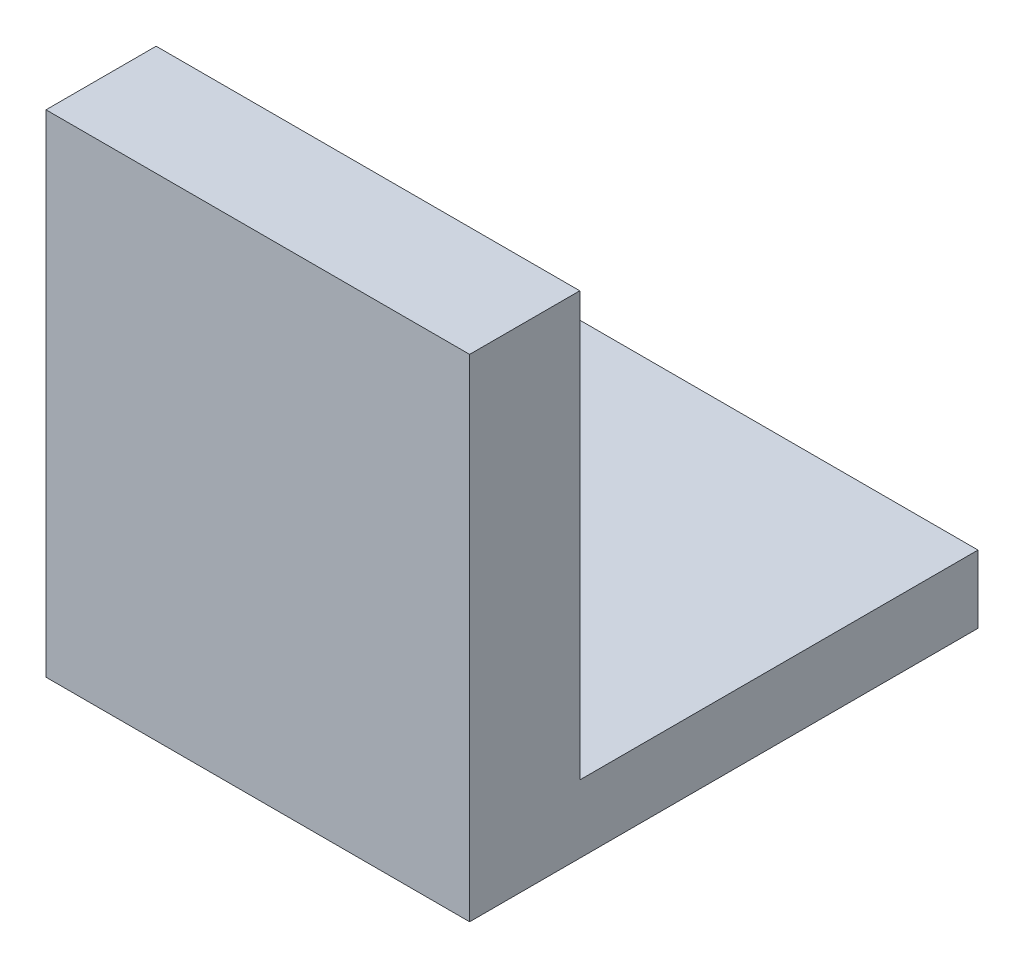
ISO-10303-21;
HEADER;
FILE_DESCRIPTION(('STEP AP214'),'2;1');
FILE_NAME('part.step','',(''),(''),'','','');
FILE_SCHEMA(('AUTOMOTIVE_DESIGN { 1 0 10303 214 1 1 1 1 }'));
ENDSEC;
DATA;
#1=APPLICATION_CONTEXT('core data for automotive mechanical design processes');
#2=APPLICATION_PROTOCOL_DEFINITION('international standard','automotive_design',2000,#1);
#3=PRODUCT_CONTEXT('',#1,'mechanical');
#4=PRODUCT('Part','Part','',(#3));
#5=PRODUCT_RELATED_PRODUCT_CATEGORY('part','',(#4));
#6=PRODUCT_DEFINITION_FORMATION('','',#4);
#7=PRODUCT_DEFINITION_CONTEXT('part definition',#1,'design');
#8=PRODUCT_DEFINITION('design','',#6,#7);
#9=PRODUCT_DEFINITION_SHAPE('','',#8);
#10=(LENGTH_UNIT() NAMED_UNIT(*) SI_UNIT(.MILLI.,.METRE.));
#11=(NAMED_UNIT(*) PLANE_ANGLE_UNIT() SI_UNIT($,.RADIAN.));
#12=(NAMED_UNIT(*) SI_UNIT($,.STERADIAN.) SOLID_ANGLE_UNIT());
#13=UNCERTAINTY_MEASURE_WITH_UNIT(LENGTH_MEASURE(1.E-05),#10,'distance_accuracy_value','');
#14=(GEOMETRIC_REPRESENTATION_CONTEXT(3) GLOBAL_UNCERTAINTY_ASSIGNED_CONTEXT((#13)) GLOBAL_UNIT_ASSIGNED_CONTEXT((#10,
#11,#12)) REPRESENTATION_CONTEXT('',''));
#15=CARTESIAN_POINT('',(0.,0.,0.));
#16=DIRECTION('',(0.,0.,1.));
#17=DIRECTION('',(1.,0.,0.));
#18=AXIS2_PLACEMENT_3D('',#15,#16,#17);
#19=CARTESIAN_POINT('',(0.,8.,0.));
#20=DIRECTION('',(0.,-1.,0.));
#21=DIRECTION('',(0.,0.,-1.));
#22=AXIS2_PLACEMENT_3D('',#19,#20,#21);
#23=PLANE('',#22);
#24=DIRECTION('',(-1.,0.,0.));
#25=VECTOR('',#24,1.);
#26=CARTESIAN_POINT('',(-25.,8.,17.));
#27=LINE('',#26,#25);
#28=CARTESIAN_POINT('',(25.,8.,17.));
#29=VERTEX_POINT('',#28);
#30=CARTESIAN_POINT('',(-25.,8.,17.));
#31=VERTEX_POINT('',#30);
#32=EDGE_CURVE('E56',#29,#31,#27,.T.);
#33=ORIENTED_EDGE('',*,*,#32,.F.);
#34=DIRECTION('',(0.,0.,-1.));
#35=VECTOR('',#34,1.);
#36=CARTESIAN_POINT('',(25.,8.,30.));
#37=LINE('',#36,#35);
#38=CARTESIAN_POINT('',(25.,8.,-30.));
#39=VERTEX_POINT('',#38);
#40=EDGE_CURVE('E94',#29,#39,#37,.T.);
#41=ORIENTED_EDGE('',*,*,#40,.T.);
#42=DIRECTION('',(-1.,0.,0.));
#43=VECTOR('',#42,1.);
#44=CARTESIAN_POINT('',(-25.,8.,-30.));
#45=LINE('',#44,#43);
#46=CARTESIAN_POINT('',(-25.,8.,-30.));
#47=VERTEX_POINT('',#46);
#48=EDGE_CURVE('E62',#39,#47,#45,.T.);
#49=ORIENTED_EDGE('',*,*,#48,.T.);
#50=DIRECTION('',(0.,0.,1.));
#51=VECTOR('',#50,1.);
#52=CARTESIAN_POINT('',(-25.,8.,30.));
#53=LINE('',#52,#51);
#54=EDGE_CURVE('E105',#47,#31,#53,.T.);
#55=ORIENTED_EDGE('',*,*,#54,.T.);
#56=EDGE_LOOP('',(#33,#41,#49,#55));
#57=FACE_BOUND('',#56,.T.);
#58=ADVANCED_FACE('F41',(#57),#23,.F.);
#59=CARTESIAN_POINT('',(25.,8.,30.));
#60=DIRECTION('',(-1.,0.,0.));
#61=DIRECTION('',(0.,0.,1.));
#62=AXIS2_PLACEMENT_3D('',#59,#60,#61);
#63=PLANE('',#62);
#64=DIRECTION('',(0.,0.,-1.));
#65=VECTOR('',#64,1.);
#66=CARTESIAN_POINT('',(25.,0.,30.));
#67=LINE('',#66,#65);
#68=CARTESIAN_POINT('',(25.,0.,30.));
#69=VERTEX_POINT('',#68);
#70=CARTESIAN_POINT('',(25.,0.,-30.));
#71=VERTEX_POINT('',#70);
#72=EDGE_CURVE('E101',#69,#71,#67,.T.);
#73=ORIENTED_EDGE('',*,*,#72,.T.);
#74=DIRECTION('',(0.,-1.,0.));
#75=VECTOR('',#74,1.);
#76=CARTESIAN_POINT('',(25.,8.,-30.));
#77=LINE('',#76,#75);
#78=EDGE_CURVE('E11',#39,#71,#77,.T.);
#79=ORIENTED_EDGE('',*,*,#78,.F.);
#80=ORIENTED_EDGE('',*,*,#40,.F.);
#81=DIRECTION('',(0.,-1.,0.));
#82=VECTOR('',#81,1.);
#83=CARTESIAN_POINT('',(25.,58.,17.));
#84=LINE('',#83,#82);
#85=CARTESIAN_POINT('',(25.,58.,17.));
#86=VERTEX_POINT('',#85);
#87=EDGE_CURVE('E109',#86,#29,#84,.T.);
#88=ORIENTED_EDGE('',*,*,#87,.F.);
#89=DIRECTION('',(0.,0.,-1.));
#90=VECTOR('',#89,1.);
#91=CARTESIAN_POINT('',(25.,58.,30.));
#92=LINE('',#91,#90);
#93=CARTESIAN_POINT('',(25.,58.,30.));
#94=VERTEX_POINT('',#93);
#95=EDGE_CURVE('E104',#94,#86,#92,.T.);
#96=ORIENTED_EDGE('',*,*,#95,.F.);
#97=DIRECTION('',(0.,-1.,0.));
#98=VECTOR('',#97,1.);
#99=CARTESIAN_POINT('',(25.,8.,30.));
#100=LINE('',#99,#98);
#101=EDGE_CURVE('E87',#94,#69,#100,.T.);
#102=ORIENTED_EDGE('',*,*,#101,.T.);
#103=EDGE_LOOP('',(#73,#79,#80,#88,#96,#102));
#104=FACE_BOUND('',#103,.T.);
#105=ADVANCED_FACE('F43',(#104),#63,.F.);
#106=CARTESIAN_POINT('',(-25.,8.,-30.));
#107=DIRECTION('',(0.,0.,1.));
#108=DIRECTION('',(1.,0.,0.));
#109=AXIS2_PLACEMENT_3D('',#106,#107,#108);
#110=PLANE('',#109);
#111=DIRECTION('',(-1.,0.,0.));
#112=VECTOR('',#111,1.);
#113=CARTESIAN_POINT('',(-25.,0.,-30.));
#114=LINE('',#113,#112);
#115=CARTESIAN_POINT('',(-25.,0.,-30.));
#116=VERTEX_POINT('',#115);
#117=EDGE_CURVE('E108',#71,#116,#114,.T.);
#118=ORIENTED_EDGE('',*,*,#117,.T.);
#119=DIRECTION('',(0.,-1.,0.));
#120=VECTOR('',#119,1.);
#121=CARTESIAN_POINT('',(-25.,8.,-30.));
#122=LINE('',#121,#120);
#123=EDGE_CURVE('E49',#47,#116,#122,.T.);
#124=ORIENTED_EDGE('',*,*,#123,.F.);
#125=ORIENTED_EDGE('',*,*,#48,.F.);
#126=ORIENTED_EDGE('',*,*,#78,.T.);
#127=EDGE_LOOP('',(#118,#124,#125,#126));
#128=FACE_BOUND('',#127,.T.);
#129=ADVANCED_FACE('F125',(#128),#110,.F.);
#130=CARTESIAN_POINT('',(-25.,8.,30.));
#131=DIRECTION('',(1.,0.,0.));
#132=DIRECTION('',(0.,0.,-1.));
#133=AXIS2_PLACEMENT_3D('',#130,#131,#132);
#134=PLANE('',#133);
#135=DIRECTION('',(0.,0.,1.));
#136=VECTOR('',#135,1.);
#137=CARTESIAN_POINT('',(-25.,0.,30.));
#138=LINE('',#137,#136);
#139=CARTESIAN_POINT('',(-25.,0.,30.));
#140=VERTEX_POINT('',#139);
#141=EDGE_CURVE('E95',#116,#140,#138,.T.);
#142=ORIENTED_EDGE('',*,*,#141,.T.);
#143=DIRECTION('',(0.,-1.,0.));
#144=VECTOR('',#143,1.);
#145=CARTESIAN_POINT('',(-25.,8.,30.));
#146=LINE('',#145,#144);
#147=CARTESIAN_POINT('',(-25.,58.,30.));
#148=VERTEX_POINT('',#147);
#149=EDGE_CURVE('E90',#148,#140,#146,.T.);
#150=ORIENTED_EDGE('',*,*,#149,.F.);
#151=DIRECTION('',(0.,0.,1.));
#152=VECTOR('',#151,1.);
#153=CARTESIAN_POINT('',(-25.,58.,30.));
#154=LINE('',#153,#152);
#155=CARTESIAN_POINT('',(-25.,58.,17.));
#156=VERTEX_POINT('',#155);
#157=EDGE_CURVE('E145',#156,#148,#154,.T.);
#158=ORIENTED_EDGE('',*,*,#157,.F.);
#159=DIRECTION('',(0.,-1.,0.));
#160=VECTOR('',#159,1.);
#161=CARTESIAN_POINT('',(-25.,58.,17.));
#162=LINE('',#161,#160);
#163=EDGE_CURVE('E113',#156,#31,#162,.T.);
#164=ORIENTED_EDGE('',*,*,#163,.T.);
#165=ORIENTED_EDGE('',*,*,#54,.F.);
#166=ORIENTED_EDGE('',*,*,#123,.T.);
#167=EDGE_LOOP('',(#142,#150,#158,#164,#165,#166));
#168=FACE_BOUND('',#167,.T.);
#169=ADVANCED_FACE('F122',(#168),#134,.F.);
#170=CARTESIAN_POINT('',(-25.,8.,30.));
#171=DIRECTION('',(0.,0.,-1.));
#172=DIRECTION('',(-1.,0.,0.));
#173=AXIS2_PLACEMENT_3D('',#170,#171,#172);
#174=PLANE('',#173);
#175=DIRECTION('',(1.,0.,0.));
#176=VECTOR('',#175,1.);
#177=CARTESIAN_POINT('',(-25.,0.,30.));
#178=LINE('',#177,#176);
#179=EDGE_CURVE('E82',#140,#69,#178,.T.);
#180=ORIENTED_EDGE('',*,*,#179,.T.);
#181=ORIENTED_EDGE('',*,*,#101,.F.);
#182=DIRECTION('',(1.,0.,0.));
#183=VECTOR('',#182,1.);
#184=CARTESIAN_POINT('',(-25.,58.,30.));
#185=LINE('',#184,#183);
#186=EDGE_CURVE('E141',#148,#94,#185,.T.);
#187=ORIENTED_EDGE('',*,*,#186,.F.);
#188=ORIENTED_EDGE('',*,*,#149,.T.);
#189=EDGE_LOOP('',(#180,#181,#187,#188));
#190=FACE_BOUND('',#189,.T.);
#191=ADVANCED_FACE('F84',(#190),#174,.F.);
#192=CARTESIAN_POINT('',(0.,0.,0.));
#193=DIRECTION('',(0.,-1.,0.));
#194=DIRECTION('',(0.,0.,-1.));
#195=AXIS2_PLACEMENT_3D('',#192,#193,#194);
#196=PLANE('',#195);
#197=ORIENTED_EDGE('',*,*,#72,.F.);
#198=ORIENTED_EDGE('',*,*,#179,.F.);
#199=ORIENTED_EDGE('',*,*,#141,.F.);
#200=ORIENTED_EDGE('',*,*,#117,.F.);
#201=EDGE_LOOP('',(#197,#198,#199,#200));
#202=FACE_BOUND('',#201,.T.);
#203=ADVANCED_FACE('F107',(#202),#196,.T.);
#204=CARTESIAN_POINT('',(-25.,58.,17.));
#205=DIRECTION('',(0.,0.,1.));
#206=DIRECTION('',(1.,0.,0.));
#207=AXIS2_PLACEMENT_3D('',#204,#205,#206);
#208=PLANE('',#207);
#209=ORIENTED_EDGE('',*,*,#32,.T.);
#210=ORIENTED_EDGE('',*,*,#163,.F.);
#211=DIRECTION('',(-1.,0.,0.));
#212=VECTOR('',#211,1.);
#213=CARTESIAN_POINT('',(-25.,58.,17.));
#214=LINE('',#213,#212);
#215=EDGE_CURVE('E134',#86,#156,#214,.T.);
#216=ORIENTED_EDGE('',*,*,#215,.F.);
#217=ORIENTED_EDGE('',*,*,#87,.T.);
#218=EDGE_LOOP('',(#209,#210,#216,#217));
#219=FACE_BOUND('',#218,.T.);
#220=ADVANCED_FACE('F130',(#219),#208,.F.);
#221=CARTESIAN_POINT('',(0.,58.,0.));
#222=DIRECTION('',(0.,-1.,0.));
#223=DIRECTION('',(0.,0.,-1.));
#224=AXIS2_PLACEMENT_3D('',#221,#222,#223);
#225=PLANE('',#224);
#226=ORIENTED_EDGE('',*,*,#157,.T.);
#227=ORIENTED_EDGE('',*,*,#186,.T.);
#228=ORIENTED_EDGE('',*,*,#95,.T.);
#229=ORIENTED_EDGE('',*,*,#215,.T.);
#230=EDGE_LOOP('',(#226,#227,#228,#229));
#231=FACE_BOUND('',#230,.T.);
#232=ADVANCED_FACE('F150',(#231),#225,.F.);
#233=CLOSED_SHELL('',(#58,#105,#129,#169,#191,#203,#220,#232));
#234=MANIFOLD_SOLID_BREP('B2',#233);
#235=ADVANCED_BREP_SHAPE_REPRESENTATION('',(#18,#234),#14);
#236=SHAPE_DEFINITION_REPRESENTATION(#9,#235);
ENDSEC;
END-ISO-10303-21;
